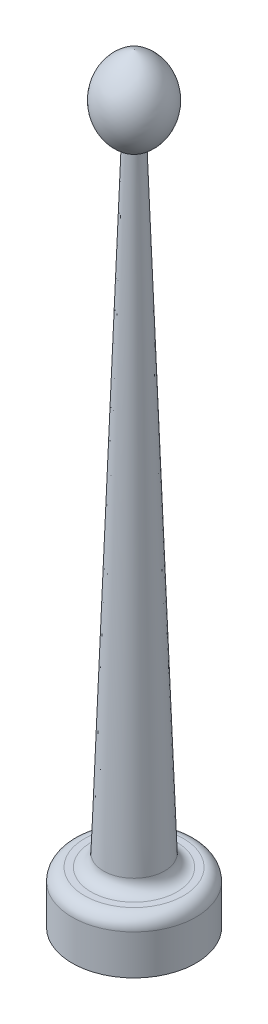
ISO-10303-21;
HEADER;
FILE_DESCRIPTION(('STEP AP214'),'2;1');
FILE_NAME('part.step','',(''),(''),'','','');
FILE_SCHEMA(('AUTOMOTIVE_DESIGN { 1 0 10303 214 1 1 1 1 }'));
ENDSEC;
DATA;
#1=APPLICATION_CONTEXT('core data for automotive mechanical design processes');
#2=APPLICATION_PROTOCOL_DEFINITION('international standard','automotive_design',2000,#1);
#3=PRODUCT_CONTEXT('',#1,'mechanical');
#4=PRODUCT('Part','Part','',(#3));
#5=PRODUCT_RELATED_PRODUCT_CATEGORY('part','',(#4));
#6=PRODUCT_DEFINITION_FORMATION('','',#4);
#7=PRODUCT_DEFINITION_CONTEXT('part definition',#1,'design');
#8=PRODUCT_DEFINITION('design','',#6,#7);
#9=PRODUCT_DEFINITION_SHAPE('','',#8);
#10=(LENGTH_UNIT() NAMED_UNIT(*) SI_UNIT(.MILLI.,.METRE.));
#11=(NAMED_UNIT(*) PLANE_ANGLE_UNIT() SI_UNIT($,.RADIAN.));
#12=(NAMED_UNIT(*) SI_UNIT($,.STERADIAN.) SOLID_ANGLE_UNIT());
#13=UNCERTAINTY_MEASURE_WITH_UNIT(LENGTH_MEASURE(1.E-05),#10,'distance_accuracy_value','');
#14=(GEOMETRIC_REPRESENTATION_CONTEXT(3) GLOBAL_UNCERTAINTY_ASSIGNED_CONTEXT((#13)) GLOBAL_UNIT_ASSIGNED_CONTEXT((#10,
#11,#12)) REPRESENTATION_CONTEXT('',''));
#15=CARTESIAN_POINT('',(0.,0.,0.));
#16=DIRECTION('',(0.,0.,1.));
#17=DIRECTION('',(1.,0.,0.));
#18=AXIS2_PLACEMENT_3D('',#15,#16,#17);
#19=CARTESIAN_POINT('',(0.,0.,0.));
#20=DIRECTION('',(0.,-1.,0.));
#21=DIRECTION('',(0.,0.,-1.));
#22=AXIS2_PLACEMENT_3D('',#19,#20,#21);
#23=PLANE('',#22);
#24=CARTESIAN_POINT('',(0.,0.,0.));
#25=DIRECTION('',(0.,-1.,0.));
#26=DIRECTION('',(0.,0.,-1.));
#27=AXIS2_PLACEMENT_3D('',#24,#25,#26);
#28=CIRCLE('',#27,2.5);
#29=CARTESIAN_POINT('',(0.,0.,-2.5));
#30=VERTEX_POINT('',#29);
#31=EDGE_CURVE('E11',#30,#30,#28,.T.);
#32=ORIENTED_EDGE('',*,*,#31,.T.);
#33=EDGE_LOOP('',(#32));
#34=FACE_BOUND('',#33,.T.);
#35=ADVANCED_FACE('F47',(#34),#23,.T.);
#36=CARTESIAN_POINT('',(0.,0.,0.));
#37=DIRECTION('',(0.,-1.,0.));
#38=DIRECTION('',(0.,0.,-1.));
#39=AXIS2_PLACEMENT_3D('',#36,#37,#38);
#40=CYLINDRICAL_SURFACE('',#39,2.5);
#41=CARTESIAN_POINT('',(0.,1.60795591426562,0.));
#42=DIRECTION('',(0.,-1.,0.));
#43=DIRECTION('',(0.,0.,-1.));
#44=AXIS2_PLACEMENT_3D('',#41,#42,#43);
#45=CIRCLE('',#44,2.5);
#46=CARTESIAN_POINT('',(0.,1.60795591426562,-2.5));
#47=VERTEX_POINT('',#46);
#48=EDGE_CURVE('E54',#47,#47,#45,.T.);
#49=ORIENTED_EDGE('',*,*,#48,.T.);
#50=EDGE_LOOP('',(#49));
#51=FACE_BOUND('',#50,.T.);
#52=ORIENTED_EDGE('',*,*,#31,.F.);
#53=EDGE_LOOP('',(#52));
#54=FACE_BOUND('',#53,.T.);
#55=ADVANCED_FACE('F85',(#51,#54),#40,.T.);
#56=CARTESIAN_POINT('',(0.,1.60795591426563,0.));
#57=DIRECTION('',(0.,-1.,0.));
#58=DIRECTION('',(0.,0.,-1.));
#59=AXIS2_PLACEMENT_3D('',#56,#57,#58);
#60=TOROIDAL_SURFACE('',#59,2.,0.5);
#61=CARTESIAN_POINT('',(0.,2.10795591426563,0.));
#62=DIRECTION('',(0.,-1.,0.));
#63=DIRECTION('',(0.,0.,-1.));
#64=AXIS2_PLACEMENT_3D('',#61,#62,#63);
#65=CIRCLE('',#64,2.);
#66=CARTESIAN_POINT('',(0.,2.10795591426563,-2.));
#67=VERTEX_POINT('',#66);
#68=EDGE_CURVE('E77',#67,#67,#65,.T.);
#69=ORIENTED_EDGE('',*,*,#68,.T.);
#70=EDGE_LOOP('',(#69));
#71=FACE_BOUND('',#70,.T.);
#72=ORIENTED_EDGE('',*,*,#48,.F.);
#73=EDGE_LOOP('',(#72));
#74=FACE_BOUND('',#73,.T.);
#75=ADVANCED_FACE('F88',(#71,#74),#60,.T.);
#76=CARTESIAN_POINT('',(2.,2.10795591426563,0.));
#77=DIRECTION('',(0.,1.,0.));
#78=DIRECTION('',(0.,0.,1.));
#79=AXIS2_PLACEMENT_3D('',#76,#77,#78);
#80=PLANE('',#79);
#81=CARTESIAN_POINT('',(0.,2.10795591426563,0.));
#82=DIRECTION('',(0.,-1.,0.));
#83=DIRECTION('',(0.,0.,-1.));
#84=AXIS2_PLACEMENT_3D('',#81,#82,#83);
#85=CIRCLE('',#84,1.73284438740354);
#86=CARTESIAN_POINT('',(0.,2.10795591426563,-1.73284438740354));
#87=VERTEX_POINT('',#86);
#88=EDGE_CURVE('E71',#87,#87,#85,.T.);
#89=ORIENTED_EDGE('',*,*,#88,.T.);
#90=EDGE_LOOP('',(#89));
#91=FACE_BOUND('',#90,.T.);
#92=ORIENTED_EDGE('',*,*,#68,.F.);
#93=EDGE_LOOP('',(#92));
#94=FACE_BOUND('',#93,.T.);
#95=ADVANCED_FACE('F90',(#91,#94),#80,.T.);
#96=CARTESIAN_POINT('',(0.,2.60795591426563,0.));
#97=DIRECTION('',(0.,-1.,0.));
#98=DIRECTION('',(0.,0.,-1.));
#99=AXIS2_PLACEMENT_3D('',#96,#97,#98);
#100=TOROIDAL_SURFACE('',#99,1.73284438740354,0.5);
#101=CARTESIAN_POINT('',(0.,2.59050616591438,0.));
#102=DIRECTION('',(0.,-1.,0.));
#103=DIRECTION('',(0.,0.,-1.));
#104=AXIS2_PLACEMENT_3D('',#101,#102,#103);
#105=CIRCLE('',#104,1.23314897389399);
#106=CARTESIAN_POINT('',(0.,2.59050616591438,-1.23314897389399));
#107=VERTEX_POINT('',#106);
#108=EDGE_CURVE('E67',#107,#107,#105,.T.);
#109=ORIENTED_EDGE('',*,*,#108,.T.);
#110=EDGE_LOOP('',(#109));
#111=FACE_BOUND('',#110,.T.);
#112=ORIENTED_EDGE('',*,*,#88,.F.);
#113=EDGE_LOOP('',(#112));
#114=FACE_BOUND('',#113,.T.);
#115=ADVANCED_FACE('F97',(#111,#114),#100,.F.);
#116=CARTESIAN_POINT('',(0.,2.59050616591438,0.));
#117=DIRECTION('',(0.,-1.,0.));
#118=DIRECTION('',(0.,0.,-1.));
#119=AXIS2_PLACEMENT_3D('',#116,#117,#118);
#120=CONICAL_SURFACE('',#119,1.23314897389399,0.0349065850398833);
#121=CARTESIAN_POINT('',(0.,27.2999760832087,0.));
#122=DIRECTION('',(0.,-1.,0.));
#123=DIRECTION('',(0.,0.,-1.));
#124=AXIS2_PLACEMENT_3D('',#121,#122,#123);
#125=CIRCLE('',#124,0.370275270648962);
#126=CARTESIAN_POINT('',(0.,27.2999760832087,-0.370275270648962));
#127=VERTEX_POINT('',#126);
#128=EDGE_CURVE('E64',#127,#127,#125,.T.);
#129=CARTESIAN_POINT('',(0.,27.2999760832087,-0.370275270648962));
#130=CARTESIAN_POINT('',(0.,27.0425857715702,-0.379263538391098));
#131=CARTESIAN_POINT('',(0.,26.7851954599318,-0.388251806133234));
#132=CARTESIAN_POINT('',(0.,26.2704148366548,-0.406228341617505));
#133=CARTESIAN_POINT('',(0.,26.0130245250163,-0.415216609359641));
#134=CARTESIAN_POINT('',(0.,25.4982439017393,-0.433193144843912));
#135=CARTESIAN_POINT('',(0.,25.2408535901009,-0.442181412586048));
#136=CARTESIAN_POINT('',(0.,24.7260729668239,-0.460157948070319));
#137=CARTESIAN_POINT('',(0.,24.4686826551854,-0.469146215812455));
#138=CARTESIAN_POINT('',(0.,23.9539020319085,-0.487122751296726));
#139=CARTESIAN_POINT('',(0.,23.69651172027,-0.496111019038862));
#140=CARTESIAN_POINT('',(0.,23.181731096993,-0.514087554523134));
#141=CARTESIAN_POINT('',(0.,22.9243407853545,-0.523075822265269));
#142=CARTESIAN_POINT('',(0.,22.4095601620776,-0.541052357749541));
#143=CARTESIAN_POINT('',(0.,22.1521698504391,-0.550040625491676));
#144=CARTESIAN_POINT('',(0.,21.6373892271621,-0.568017160975948));
#145=CARTESIAN_POINT('',(0.,21.3799989155236,-0.577005428718084));
#146=CARTESIAN_POINT('',(0.,20.8652182922467,-0.594981964202355));
#147=CARTESIAN_POINT('',(0.,20.6078279806082,-0.603970231944491));
#148=CARTESIAN_POINT('',(0.,20.0930473573312,-0.621946767428762));
#149=CARTESIAN_POINT('',(0.,19.8356570456927,-0.630935035170898));
#150=CARTESIAN_POINT('',(0.,19.3208764224158,-0.648911570655169));
#151=CARTESIAN_POINT('',(0.,19.0634861107773,-0.657899838397305));
#152=CARTESIAN_POINT('',(0.,18.5487054875003,-0.675876373881577));
#153=CARTESIAN_POINT('',(0.,18.2913151758618,-0.684864641623712));
#154=CARTESIAN_POINT('',(0.,17.7765345525849,-0.702841177107984));
#155=CARTESIAN_POINT('',(0.,17.5191442409464,-0.711829444850119));
#156=CARTESIAN_POINT('',(0.,17.0043636176694,-0.729805980334391));
#157=CARTESIAN_POINT('',(0.,16.7469733060309,-0.738794248076526));
#158=CARTESIAN_POINT('',(0.,16.232192682754,-0.756770783560798));
#159=CARTESIAN_POINT('',(0.,15.9748023711155,-0.765759051302934));
#160=CARTESIAN_POINT('',(0.,15.4600217478385,-0.783735586787205));
#161=CARTESIAN_POINT('',(0.,15.2026314362,-0.792723854529341));
#162=CARTESIAN_POINT('',(0.,14.6878508129231,-0.810700390013612));
#163=CARTESIAN_POINT('',(0.,14.4304605012846,-0.819688657755748));
#164=CARTESIAN_POINT('',(0.,13.9156798780076,-0.837665193240019));
#165=CARTESIAN_POINT('',(0.,13.6582895663691,-0.846653460982155));
#166=CARTESIAN_POINT('',(0.,13.1435089430922,-0.864629996466426));
#167=CARTESIAN_POINT('',(0.,12.8861186314537,-0.873618264208562));
#168=CARTESIAN_POINT('',(0.,12.3713380081767,-0.891594799692833));
#169=CARTESIAN_POINT('',(0.,12.1139476965382,-0.900583067434969));
#170=CARTESIAN_POINT('',(0.,11.5991670732613,-0.918559602919241));
#171=CARTESIAN_POINT('',(0.,11.3417767616228,-0.927547870661376));
#172=CARTESIAN_POINT('',(0.,10.8269961383458,-0.945524406145648));
#173=CARTESIAN_POINT('',(0.,10.5696058267073,-0.954512673887783));
#174=CARTESIAN_POINT('',(0.,10.0548252034304,-0.972489209372055));
#175=CARTESIAN_POINT('',(0.,9.7974348917919,-0.981477477114191));
#176=CARTESIAN_POINT('',(0.,9.28265426851493,-0.999454012598462));
#177=CARTESIAN_POINT('',(0.,9.02526395687645,-1.0084422803406));
#178=CARTESIAN_POINT('',(0.,8.51048333359948,-1.02641881582487));
#179=CARTESIAN_POINT('',(0.,8.253093021961,-1.03540708356701));
#180=CARTESIAN_POINT('',(0.,7.73831239868404,-1.05338361905128));
#181=CARTESIAN_POINT('',(0.,7.48092208704555,-1.06237188679341));
#182=CARTESIAN_POINT('',(0.,6.96614146376859,-1.08034842227768));
#183=CARTESIAN_POINT('',(0.,6.7087511521301,-1.08933669001982));
#184=CARTESIAN_POINT('',(0.,6.19397052885314,-1.10731322550409));
#185=CARTESIAN_POINT('',(0.,5.93658021721466,-1.11630149324623));
#186=CARTESIAN_POINT('',(0.,5.42179959393769,-1.1342780287305));
#187=CARTESIAN_POINT('',(0.,5.16440928229921,-1.14326629647263));
#188=CARTESIAN_POINT('',(0.,4.64962865902224,-1.1612428319569));
#189=CARTESIAN_POINT('',(0.,4.39223834738376,-1.17023109969904));
#190=CARTESIAN_POINT('',(0.,3.87745772410679,-1.18820763518331));
#191=CARTESIAN_POINT('',(0.,3.62006741246831,-1.19719590292545));
#192=CARTESIAN_POINT('',(0.,3.10528678919135,-1.21517243840972));
#193=CARTESIAN_POINT('',(0.,2.84789647755286,-1.22416070615185));
#194=CARTESIAN_POINT('',(0.,2.59050616591438,-1.23314897389399));
#195=B_SPLINE_CURVE_WITH_KNOTS('',3,(#129,#130,#131,#132,#133,#134,#135,#136,#137,#138,#139,
#140,#141,#142,#143,#144,#145,#146,#147,#148,#149,#150,#151,#152,#153,#154,#155,#156,#157,#158,
#159,#160,#161,#162,#163,#164,#165,#166,#167,#168,#169,#170,#171,#172,#173,#174,#175,#176,#177,
#178,#179,#180,#181,#182,#183,#184,#185,#186,#187,#188,#189,#190,#191,#192,#193,#194),
.UNSPECIFIED.,.F.,.F.,(4,2,2,2,2,2,2,2,2,2,2,2,2,2,2,2,2,2,2,2,2,2,2,2,2,2,2,2,2,2,2,2,4),(0.,
0.772641607306543,1.54528321461308,2.31792482191963,3.09056642922617,3.86320803653271,
4.63584964383925,5.40849125114579,6.18113285845233,6.95377446575887,7.72641607306542,
8.49905768037196,9.2716992876785,10.044340894985,10.8169825022916,11.5896241095981,
12.3622657169047,13.1349073242112,13.9075489315177,14.6801905388243,15.4528321461308,
16.2254737534374,16.9981153607439,17.7707569680505,18.543398575357,19.3160401826635,
20.0886817899701,20.8613233972766,21.6339650045832,22.4066066118897,23.1792482191962,
23.9518898265028,24.7245314338093),.UNSPECIFIED.);
#196=EDGE_CURVE('BSEAM60',#127,#107,#195,.T.);
#197=ORIENTED_EDGE('',*,*,#128,.T.);
#198=ORIENTED_EDGE('',*,*,#108,.F.);
#199=ORIENTED_EDGE('',*,*,#196,.T.);
#200=ORIENTED_EDGE('',*,*,#196,.F.);
#201=EDGE_LOOP('',(#197,#199,#198,#200));
#202=FACE_BOUND('',#201,.T.);
#203=ADVANCED_FACE('F60',(#202),#120,.T.);
#204=CARTESIAN_POINT('',(0.,28.9213391930408,0.514135244704657));
#205=DIRECTION('',(-1.,0.,0.));
#206=DIRECTION('',(0.,0.,-1.));
#207=AXIS2_PLACEMENT_3D('',#204,#205,#206);
#208=CIRCLE('',#207,1.84688935607753);
#209=TRIMMED_CURVE('',#208,(PARAMETER_VALUE(-1.28869032605787)),
(PARAMETER_VALUE(1.28869032605787)),.T.,.PARAMETER.);
#210=CARTESIAN_POINT('',(0.,28.9213391930408,0.));
#211=DIRECTION('',(0.,-1.,0.));
#212=AXIS1_PLACEMENT('',#210,#211);
#213=SURFACE_OF_REVOLUTION('',#209,#212);
#214=CARTESIAN_POINT('',(0.,30.6952234180524,0.));
#215=VERTEX_POINT('',#214);
#216=VERTEX_LOOP('',#215);
#217=FACE_BOUND('',#216,.T.);
#218=ORIENTED_EDGE('',*,*,#128,.F.);
#219=EDGE_LOOP('',(#218));
#220=FACE_BOUND('',#219,.T.);
#221=ADVANCED_FACE('F57',(#217,#220),#213,.T.);
#222=CLOSED_SHELL('',(#35,#55,#75,#95,#115,#203,#221));
#223=MANIFOLD_SOLID_BREP('B2',#222);
#224=ADVANCED_BREP_SHAPE_REPRESENTATION('',(#18,#223),#14);
#225=SHAPE_DEFINITION_REPRESENTATION(#9,#224);
ENDSEC;
END-ISO-10303-21;
